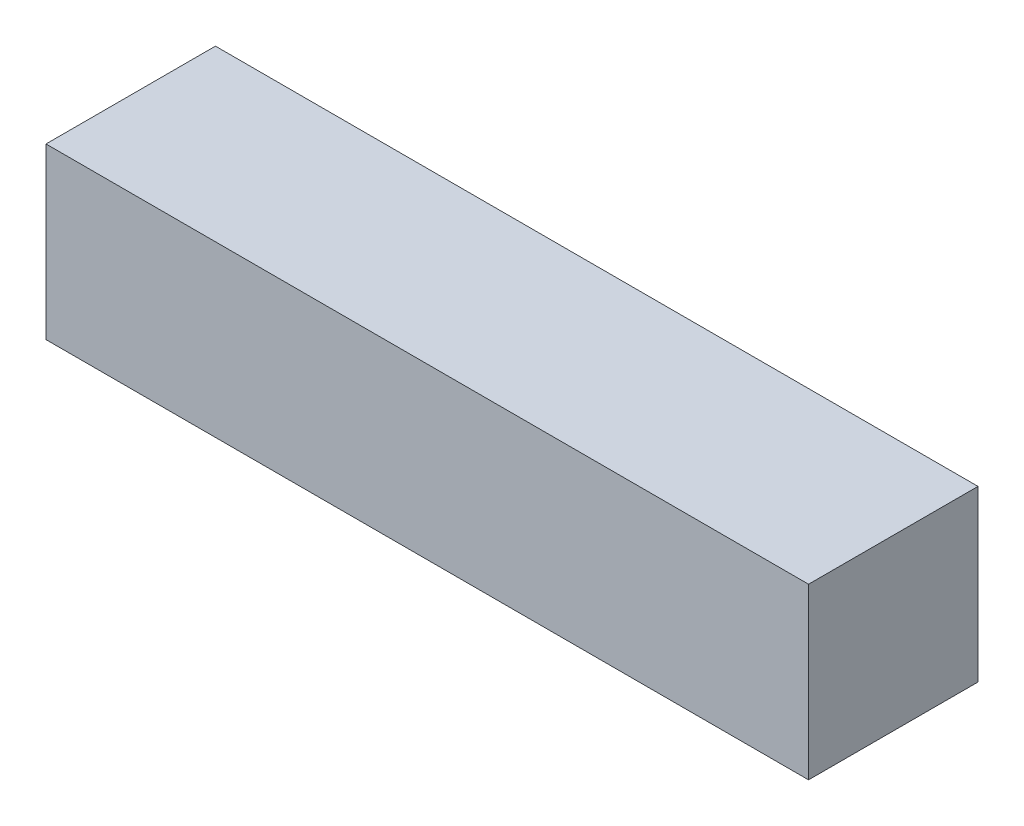
ISO-10303-21;
HEADER;
FILE_DESCRIPTION(('STEP AP214'),'2;1');
FILE_NAME('part.step','',(''),(''),'','','');
FILE_SCHEMA(('AUTOMOTIVE_DESIGN { 1 0 10303 214 1 1 1 1 }'));
ENDSEC;
DATA;
#1=APPLICATION_CONTEXT('core data for automotive mechanical design processes');
#2=APPLICATION_PROTOCOL_DEFINITION('international standard','automotive_design',2000,#1);
#3=PRODUCT_CONTEXT('',#1,'mechanical');
#4=PRODUCT('Part','Part','',(#3));
#5=PRODUCT_RELATED_PRODUCT_CATEGORY('part','',(#4));
#6=PRODUCT_DEFINITION_FORMATION('','',#4);
#7=PRODUCT_DEFINITION_CONTEXT('part definition',#1,'design');
#8=PRODUCT_DEFINITION('design','',#6,#7);
#9=PRODUCT_DEFINITION_SHAPE('','',#8);
#10=(LENGTH_UNIT() NAMED_UNIT(*) SI_UNIT(.MILLI.,.METRE.));
#11=(NAMED_UNIT(*) PLANE_ANGLE_UNIT() SI_UNIT($,.RADIAN.));
#12=(NAMED_UNIT(*) SI_UNIT($,.STERADIAN.) SOLID_ANGLE_UNIT());
#13=UNCERTAINTY_MEASURE_WITH_UNIT(LENGTH_MEASURE(1.E-05),#10,'distance_accuracy_value','');
#14=(GEOMETRIC_REPRESENTATION_CONTEXT(3) GLOBAL_UNCERTAINTY_ASSIGNED_CONTEXT((#13)) GLOBAL_UNIT_ASSIGNED_CONTEXT((#10,
#11,#12)) REPRESENTATION_CONTEXT('',''));
#15=CARTESIAN_POINT('',(0.,0.,0.));
#16=DIRECTION('',(0.,0.,1.));
#17=DIRECTION('',(1.,0.,0.));
#18=AXIS2_PLACEMENT_3D('',#15,#16,#17);
#19=CARTESIAN_POINT('',(0.,0.,60.));
#20=DIRECTION('',(1.,0.,0.));
#21=DIRECTION('',(0.,0.,-1.));
#22=AXIS2_PLACEMENT_3D('',#19,#20,#21);
#23=PLANE('',#22);
#24=DIRECTION('',(0.,-1.,0.));
#25=VECTOR('',#24,1.);
#26=CARTESIAN_POINT('',(0.,0.,0.));
#27=LINE('',#26,#25);
#28=CARTESIAN_POINT('',(0.,60.,0.));
#29=VERTEX_POINT('',#28);
#30=CARTESIAN_POINT('',(0.,0.,0.));
#31=VERTEX_POINT('',#30);
#32=EDGE_CURVE('E96',#29,#31,#27,.T.);
#33=ORIENTED_EDGE('',*,*,#32,.T.);
#34=DIRECTION('',(0.,0.,-1.));
#35=VECTOR('',#34,1.);
#36=CARTESIAN_POINT('',(0.,0.,60.));
#37=LINE('',#36,#35);
#38=CARTESIAN_POINT('',(0.,0.,60.));
#39=VERTEX_POINT('',#38);
#40=EDGE_CURVE('E11',#39,#31,#37,.T.);
#41=ORIENTED_EDGE('',*,*,#40,.F.);
#42=DIRECTION('',(0.,-1.,0.));
#43=VECTOR('',#42,1.);
#44=CARTESIAN_POINT('',(0.,0.,60.));
#45=LINE('',#44,#43);
#46=CARTESIAN_POINT('',(0.,60.,60.));
#47=VERTEX_POINT('',#46);
#48=EDGE_CURVE('E84',#47,#39,#45,.T.);
#49=ORIENTED_EDGE('',*,*,#48,.F.);
#50=DIRECTION('',(0.,0.,-1.));
#51=VECTOR('',#50,1.);
#52=CARTESIAN_POINT('',(0.,60.,60.));
#53=LINE('',#52,#51);
#54=EDGE_CURVE('E92',#47,#29,#53,.T.);
#55=ORIENTED_EDGE('',*,*,#54,.T.);
#56=EDGE_LOOP('',(#33,#41,#49,#55));
#57=FACE_BOUND('',#56,.T.);
#58=ADVANCED_FACE('F33',(#57),#23,.F.);
#59=CARTESIAN_POINT('',(0.,0.,60.));
#60=DIRECTION('',(0.,1.,0.));
#61=DIRECTION('',(0.,0.,1.));
#62=AXIS2_PLACEMENT_3D('',#59,#60,#61);
#63=PLANE('',#62);
#64=DIRECTION('',(1.,0.,0.));
#65=VECTOR('',#64,1.);
#66=CARTESIAN_POINT('',(0.,0.,0.));
#67=LINE('',#66,#65);
#68=CARTESIAN_POINT('',(270.,0.,0.));
#69=VERTEX_POINT('',#68);
#70=EDGE_CURVE('E88',#31,#69,#67,.T.);
#71=ORIENTED_EDGE('',*,*,#70,.T.);
#72=DIRECTION('',(0.,0.,-1.));
#73=VECTOR('',#72,1.);
#74=CARTESIAN_POINT('',(270.,0.,60.));
#75=LINE('',#74,#73);
#76=CARTESIAN_POINT('',(270.,0.,60.));
#77=VERTEX_POINT('',#76);
#78=EDGE_CURVE('E41',#77,#69,#75,.T.);
#79=ORIENTED_EDGE('',*,*,#78,.F.);
#80=DIRECTION('',(1.,0.,0.));
#81=VECTOR('',#80,1.);
#82=CARTESIAN_POINT('',(0.,0.,60.));
#83=LINE('',#82,#81);
#84=EDGE_CURVE('E79',#39,#77,#83,.T.);
#85=ORIENTED_EDGE('',*,*,#84,.F.);
#86=ORIENTED_EDGE('',*,*,#40,.T.);
#87=EDGE_LOOP('',(#71,#79,#85,#86));
#88=FACE_BOUND('',#87,.T.);
#89=ADVANCED_FACE('F87',(#88),#63,.F.);
#90=CARTESIAN_POINT('',(270.,0.,60.));
#91=DIRECTION('',(-1.,0.,0.));
#92=DIRECTION('',(0.,0.,1.));
#93=AXIS2_PLACEMENT_3D('',#90,#91,#92);
#94=PLANE('',#93);
#95=DIRECTION('',(0.,1.,0.));
#96=VECTOR('',#95,1.);
#97=CARTESIAN_POINT('',(270.,0.,0.));
#98=LINE('',#97,#96);
#99=CARTESIAN_POINT('',(270.,60.,0.));
#100=VERTEX_POINT('',#99);
#101=EDGE_CURVE('E66',#69,#100,#98,.T.);
#102=ORIENTED_EDGE('',*,*,#101,.T.);
#103=DIRECTION('',(0.,0.,-1.));
#104=VECTOR('',#103,1.);
#105=CARTESIAN_POINT('',(270.,60.,60.));
#106=LINE('',#105,#104);
#107=CARTESIAN_POINT('',(270.,60.,60.));
#108=VERTEX_POINT('',#107);
#109=EDGE_CURVE('E89',#108,#100,#106,.T.);
#110=ORIENTED_EDGE('',*,*,#109,.F.);
#111=DIRECTION('',(0.,1.,0.));
#112=VECTOR('',#111,1.);
#113=CARTESIAN_POINT('',(270.,0.,60.));
#114=LINE('',#113,#112);
#115=EDGE_CURVE('E82',#77,#108,#114,.T.);
#116=ORIENTED_EDGE('',*,*,#115,.F.);
#117=ORIENTED_EDGE('',*,*,#78,.T.);
#118=EDGE_LOOP('',(#102,#110,#116,#117));
#119=FACE_BOUND('',#118,.T.);
#120=ADVANCED_FACE('F90',(#119),#94,.F.);
#121=CARTESIAN_POINT('',(0.,60.,60.));
#122=DIRECTION('',(0.,-1.,0.));
#123=DIRECTION('',(0.,0.,-1.));
#124=AXIS2_PLACEMENT_3D('',#121,#122,#123);
#125=PLANE('',#124);
#126=DIRECTION('',(-1.,0.,0.));
#127=VECTOR('',#126,1.);
#128=CARTESIAN_POINT('',(0.,60.,0.));
#129=LINE('',#128,#127);
#130=EDGE_CURVE('E72',#100,#29,#129,.T.);
#131=ORIENTED_EDGE('',*,*,#130,.T.);
#132=ORIENTED_EDGE('',*,*,#54,.F.);
#133=DIRECTION('',(-1.,0.,0.));
#134=VECTOR('',#133,1.);
#135=CARTESIAN_POINT('',(0.,60.,60.));
#136=LINE('',#135,#134);
#137=EDGE_CURVE('E49',#108,#47,#136,.T.);
#138=ORIENTED_EDGE('',*,*,#137,.F.);
#139=ORIENTED_EDGE('',*,*,#109,.T.);
#140=EDGE_LOOP('',(#131,#132,#138,#139));
#141=FACE_BOUND('',#140,.T.);
#142=ADVANCED_FACE('F103',(#141),#125,.F.);
#143=CARTESIAN_POINT('',(0.,0.,60.));
#144=DIRECTION('',(0.,0.,-1.));
#145=DIRECTION('',(-1.,0.,0.));
#146=AXIS2_PLACEMENT_3D('',#143,#144,#145);
#147=PLANE('',#146);
#148=ORIENTED_EDGE('',*,*,#48,.T.);
#149=ORIENTED_EDGE('',*,*,#84,.T.);
#150=ORIENTED_EDGE('',*,*,#115,.T.);
#151=ORIENTED_EDGE('',*,*,#137,.T.);
#152=EDGE_LOOP('',(#148,#149,#150,#151));
#153=FACE_BOUND('',#152,.T.);
#154=ADVANCED_FACE('F80',(#153),#147,.F.);
#155=CARTESIAN_POINT('',(0.,0.,0.));
#156=DIRECTION('',(0.,0.,-1.));
#157=DIRECTION('',(-1.,0.,0.));
#158=AXIS2_PLACEMENT_3D('',#155,#156,#157);
#159=PLANE('',#158);
#160=ORIENTED_EDGE('',*,*,#32,.F.);
#161=ORIENTED_EDGE('',*,*,#130,.F.);
#162=ORIENTED_EDGE('',*,*,#101,.F.);
#163=ORIENTED_EDGE('',*,*,#70,.F.);
#164=EDGE_LOOP('',(#160,#161,#162,#163));
#165=FACE_BOUND('',#164,.T.);
#166=ADVANCED_FACE('F106',(#165),#159,.T.);
#167=CLOSED_SHELL('',(#58,#89,#120,#142,#154,#166));
#168=MANIFOLD_SOLID_BREP('B2',#167);
#169=ADVANCED_BREP_SHAPE_REPRESENTATION('',(#18,#168),#14);
#170=SHAPE_DEFINITION_REPRESENTATION(#9,#169);
ENDSEC;
END-ISO-10303-21;
